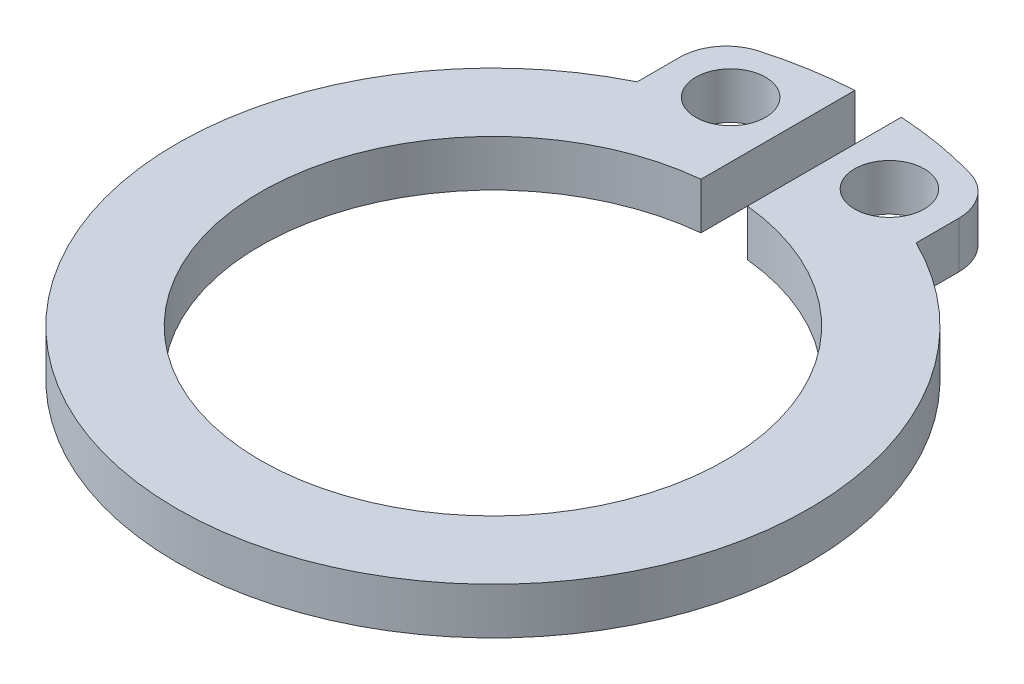
ISO-10303-21;
HEADER;
FILE_DESCRIPTION(('STEP AP214'),'2;1');
FILE_NAME('part.step','',(''),(''),'','','');
FILE_SCHEMA(('AUTOMOTIVE_DESIGN { 1 0 10303 214 1 1 1 1 }'));
ENDSEC;
DATA;
#1=APPLICATION_CONTEXT('core data for automotive mechanical design processes');
#2=APPLICATION_PROTOCOL_DEFINITION('international standard','automotive_design',2000,#1);
#3=PRODUCT_CONTEXT('',#1,'mechanical');
#4=PRODUCT('Part','Part','',(#3));
#5=PRODUCT_RELATED_PRODUCT_CATEGORY('part','',(#4));
#6=PRODUCT_DEFINITION_FORMATION('','',#4);
#7=PRODUCT_DEFINITION_CONTEXT('part definition',#1,'design');
#8=PRODUCT_DEFINITION('design','',#6,#7);
#9=PRODUCT_DEFINITION_SHAPE('','',#8);
#10=(LENGTH_UNIT() NAMED_UNIT(*) SI_UNIT(.MILLI.,.METRE.));
#11=(NAMED_UNIT(*) PLANE_ANGLE_UNIT() SI_UNIT($,.RADIAN.));
#12=(NAMED_UNIT(*) SI_UNIT($,.STERADIAN.) SOLID_ANGLE_UNIT());
#13=UNCERTAINTY_MEASURE_WITH_UNIT(LENGTH_MEASURE(1.E-05),#10,'distance_accuracy_value','');
#14=(GEOMETRIC_REPRESENTATION_CONTEXT(3) GLOBAL_UNCERTAINTY_ASSIGNED_CONTEXT((#13)) GLOBAL_UNIT_ASSIGNED_CONTEXT((#10,
#11,#12)) REPRESENTATION_CONTEXT('',''));
#15=CARTESIAN_POINT('',(0.,0.,0.));
#16=DIRECTION('',(0.,0.,1.));
#17=DIRECTION('',(1.,0.,0.));
#18=AXIS2_PLACEMENT_3D('',#15,#16,#17);
#19=CARTESIAN_POINT('',(0.,1.,0.));
#20=DIRECTION('',(0.,-1.,0.));
#21=DIRECTION('',(0.,0.,-1.));
#22=AXIS2_PLACEMENT_3D('',#19,#20,#21);
#23=CYLINDRICAL_SURFACE('',#22,6.8);
#24=CARTESIAN_POINT('',(0.,1.,0.));
#25=DIRECTION('',(0.,1.,0.));
#26=DIRECTION('',(0.,0.,1.));
#27=AXIS2_PLACEMENT_3D('',#24,#25,#26);
#28=CIRCLE('',#27,6.8);
#29=CARTESIAN_POINT('',(-3.,1.,-6.10245852095694));
#30=VERTEX_POINT('',#29);
#31=CARTESIAN_POINT('',(3.,1.,-6.10245852095694));
#32=VERTEX_POINT('',#31);
#33=EDGE_CURVE('E151',#30,#32,#28,.T.);
#34=ORIENTED_EDGE('',*,*,#33,.F.);
#35=DIRECTION('',(0.,-1.,0.));
#36=VECTOR('',#35,1.);
#37=CARTESIAN_POINT('',(-3.,4.31860883601564,-6.10245852095694));
#38=LINE('',#37,#36);
#39=CARTESIAN_POINT('',(-3.,0.,-6.10245852095694));
#40=VERTEX_POINT('',#39);
#41=EDGE_CURVE('E225',#30,#40,#38,.T.);
#42=ORIENTED_EDGE('',*,*,#41,.T.);
#43=CARTESIAN_POINT('',(0.,0.,0.));
#44=DIRECTION('',(0.,1.,0.));
#45=DIRECTION('',(0.,0.,1.));
#46=AXIS2_PLACEMENT_3D('',#43,#44,#45);
#47=CIRCLE('',#46,6.8);
#48=CARTESIAN_POINT('',(3.,0.,-6.10245852095694));
#49=VERTEX_POINT('',#48);
#50=EDGE_CURVE('E145',#40,#49,#47,.T.);
#51=ORIENTED_EDGE('',*,*,#50,.T.);
#52=DIRECTION('',(0.,-1.,0.));
#53=VECTOR('',#52,1.);
#54=CARTESIAN_POINT('',(3.,4.31860883601564,-6.10245852095694));
#55=LINE('',#54,#53);
#56=EDGE_CURVE('E132',#32,#49,#55,.T.);
#57=ORIENTED_EDGE('',*,*,#56,.F.);
#58=EDGE_LOOP('',(#34,#42,#51,#57));
#59=FACE_BOUND('',#58,.T.);
#60=ADVANCED_FACE('F43',(#59),#23,.T.);
#61=CARTESIAN_POINT('',(0.,1.,0.));
#62=DIRECTION('',(0.,1.,0.));
#63=DIRECTION('',(0.,0.,1.));
#64=AXIS2_PLACEMENT_3D('',#61,#62,#63);
#65=PLANE('',#64);
#66=CARTESIAN_POINT('',(1.70769331722576,1.,-6.82103805747136));
#67=DIRECTION('',(0.,-1.,0.));
#68=DIRECTION('',(0.,0.,-1.));
#69=AXIS2_PLACEMENT_3D('',#66,#67,#68);
#70=CIRCLE('',#69,0.75);
#71=CARTESIAN_POINT('',(1.70769331722576,1.,-7.57103805747136));
#72=VERTEX_POINT('',#71);
#73=EDGE_CURVE('E141',#72,#72,#70,.T.);
#74=ORIENTED_EDGE('',*,*,#73,.T.);
#75=EDGE_LOOP('',(#74));
#76=FACE_BOUND('',#75,.T.);
#77=CARTESIAN_POINT('',(-1.70769331722576,1.,-6.82103805747136));
#78=DIRECTION('',(0.,-1.,0.));
#79=DIRECTION('',(0.,0.,1.));
#80=AXIS2_PLACEMENT_3D('',#77,#78,#79);
#81=CIRCLE('',#80,0.75);
#82=CARTESIAN_POINT('',(-1.70769331722576,1.,-6.07103805747136));
#83=VERTEX_POINT('',#82);
#84=EDGE_CURVE('E236',#83,#83,#81,.T.);
#85=ORIENTED_EDGE('',*,*,#84,.T.);
#86=EDGE_LOOP('',(#85));
#87=FACE_BOUND('',#86,.T.);
#88=CARTESIAN_POINT('',(0.,1.,0.));
#89=DIRECTION('',(0.,1.,0.));
#90=DIRECTION('',(0.,0.,1.));
#91=AXIS2_PLACEMENT_3D('',#88,#89,#90);
#92=CIRCLE('',#91,5.);
#93=CARTESIAN_POINT('',(-0.500000000000003,1.,-4.9749371855331));
#94=VERTEX_POINT('',#93);
#95=CARTESIAN_POINT('',(0.500000000000001,1.,-4.9749371855331));
#96=VERTEX_POINT('',#95);
#97=EDGE_CURVE('E126',#94,#96,#92,.T.);
#98=ORIENTED_EDGE('',*,*,#97,.F.);
#99=DIRECTION('',(0.,0.,1.));
#100=VECTOR('',#99,1.);
#101=CARTESIAN_POINT('',(-0.500000000000001,1.,-8.28492607088319));
#102=LINE('',#101,#100);
#103=CARTESIAN_POINT('',(-0.500000000000001,1.,-8.28492607088319));
#104=VERTEX_POINT('',#103);
#105=EDGE_CURVE('E67',#104,#94,#102,.T.);
#106=ORIENTED_EDGE('',*,*,#105,.F.);
#107=CARTESIAN_POINT('',(0.,1.,0.));
#108=DIRECTION('',(0.,1.,0.));
#109=DIRECTION('',(0.,0.,1.));
#110=AXIS2_PLACEMENT_3D('',#107,#108,#109);
#111=CIRCLE('',#110,8.3);
#112=CARTESIAN_POINT('',(-2.27397260273972,1.,-7.9824212242896));
#113=VERTEX_POINT('',#112);
#114=EDGE_CURVE('E221',#113,#104,#111,.F.);
#115=ORIENTED_EDGE('',*,*,#114,.F.);
#116=CARTESIAN_POINT('',(-2.,1.,-7.02068372738724));
#117=DIRECTION('',(0.,1.,0.));
#118=DIRECTION('',(0.,0.,1.));
#119=AXIS2_PLACEMENT_3D('',#116,#117,#118);
#120=CIRCLE('',#119,1.);
#121=CARTESIAN_POINT('',(-3.,1.,-7.02068372738724));
#122=VERTEX_POINT('',#121);
#123=EDGE_CURVE('E176',#113,#122,#120,.T.);
#124=ORIENTED_EDGE('',*,*,#123,.T.);
#125=DIRECTION('',(0.,0.,-1.));
#126=VECTOR('',#125,1.);
#127=CARTESIAN_POINT('',(-3.,1.,-7.73886296557834));
#128=LINE('',#127,#126);
#129=EDGE_CURVE('E215',#30,#122,#128,.T.);
#130=ORIENTED_EDGE('',*,*,#129,.F.);
#131=ORIENTED_EDGE('',*,*,#33,.T.);
#132=DIRECTION('',(0.,0.,1.));
#133=VECTOR('',#132,1.);
#134=CARTESIAN_POINT('',(3.,1.,-7.73886296557834));
#135=LINE('',#134,#133);
#136=CARTESIAN_POINT('',(3.,1.,-7.02068372738724));
#137=VERTEX_POINT('',#136);
#138=EDGE_CURVE('E203',#137,#32,#135,.T.);
#139=ORIENTED_EDGE('',*,*,#138,.F.);
#140=CARTESIAN_POINT('',(2.,1.,-7.02068372738724));
#141=DIRECTION('',(0.,1.,0.));
#142=DIRECTION('',(0.,0.,1.));
#143=AXIS2_PLACEMENT_3D('',#140,#141,#142);
#144=CIRCLE('',#143,1.);
#145=CARTESIAN_POINT('',(2.27397260273973,1.,-7.9824212242896));
#146=VERTEX_POINT('',#145);
#147=EDGE_CURVE('E173',#137,#146,#144,.T.);
#148=ORIENTED_EDGE('',*,*,#147,.T.);
#149=CARTESIAN_POINT('',(0.,1.,0.));
#150=DIRECTION('',(0.,1.,0.));
#151=DIRECTION('',(0.,0.,1.));
#152=AXIS2_PLACEMENT_3D('',#149,#150,#151);
#153=CIRCLE('',#152,8.3);
#154=CARTESIAN_POINT('',(0.500000000000001,1.,-8.28492607088319));
#155=VERTEX_POINT('',#154);
#156=EDGE_CURVE('E128',#155,#146,#153,.F.);
#157=ORIENTED_EDGE('',*,*,#156,.F.);
#158=DIRECTION('',(0.,0.,-1.));
#159=VECTOR('',#158,1.);
#160=CARTESIAN_POINT('',(0.500000000000001,1.,-8.28492607088319));
#161=LINE('',#160,#159);
#162=EDGE_CURVE('E123',#96,#155,#161,.T.);
#163=ORIENTED_EDGE('',*,*,#162,.F.);
#164=EDGE_LOOP('',(#98,#106,#115,#124,#130,#131,#139,#148,#157,#163));
#165=FACE_BOUND('',#164,.T.);
#166=ADVANCED_FACE('F124',(#76,#87,#165),#65,.T.);
#167=CARTESIAN_POINT('',(0.,0.,0.));
#168=DIRECTION('',(0.,1.,0.));
#169=DIRECTION('',(0.,0.,1.));
#170=AXIS2_PLACEMENT_3D('',#167,#168,#169);
#171=PLANE('',#170);
#172=CARTESIAN_POINT('',(1.70769331722576,0.,-6.82103805747136));
#173=DIRECTION('',(0.,-1.,0.));
#174=DIRECTION('',(0.,0.,-1.));
#175=AXIS2_PLACEMENT_3D('',#172,#173,#174);
#176=CIRCLE('',#175,0.75);
#177=CARTESIAN_POINT('',(1.70769331722576,0.,-7.57103805747136));
#178=VERTEX_POINT('',#177);
#179=EDGE_CURVE('E244',#178,#178,#176,.T.);
#180=ORIENTED_EDGE('',*,*,#179,.F.);
#181=EDGE_LOOP('',(#180));
#182=FACE_BOUND('',#181,.T.);
#183=CARTESIAN_POINT('',(-1.70769331722576,0.,-6.82103805747136));
#184=DIRECTION('',(0.,-1.,0.));
#185=DIRECTION('',(0.,0.,1.));
#186=AXIS2_PLACEMENT_3D('',#183,#184,#185);
#187=CIRCLE('',#186,0.75);
#188=CARTESIAN_POINT('',(-1.70769331722576,0.,-6.07103805747136));
#189=VERTEX_POINT('',#188);
#190=EDGE_CURVE('E240',#189,#189,#187,.T.);
#191=ORIENTED_EDGE('',*,*,#190,.F.);
#192=EDGE_LOOP('',(#191));
#193=FACE_BOUND('',#192,.T.);
#194=DIRECTION('',(0.,0.,1.));
#195=VECTOR('',#194,1.);
#196=CARTESIAN_POINT('',(-0.500000000000001,0.,-8.28492607088319));
#197=LINE('',#196,#195);
#198=CARTESIAN_POINT('',(-0.500000000000001,0.,-8.28492607088319));
#199=VERTEX_POINT('',#198);
#200=CARTESIAN_POINT('',(-0.500000000000001,0.,-4.9749371855331));
#201=VERTEX_POINT('',#200);
#202=EDGE_CURVE('E212',#199,#201,#197,.T.);
#203=ORIENTED_EDGE('',*,*,#202,.T.);
#204=CARTESIAN_POINT('',(0.,0.,0.));
#205=DIRECTION('',(0.,1.,0.));
#206=DIRECTION('',(0.,0.,1.));
#207=AXIS2_PLACEMENT_3D('',#204,#205,#206);
#208=CIRCLE('',#207,5.);
#209=CARTESIAN_POINT('',(0.500000000000003,0.,-4.9749371855331));
#210=VERTEX_POINT('',#209);
#211=EDGE_CURVE('E146',#201,#210,#208,.T.);
#212=ORIENTED_EDGE('',*,*,#211,.T.);
#213=DIRECTION('',(0.,0.,-1.));
#214=VECTOR('',#213,1.);
#215=CARTESIAN_POINT('',(0.500000000000001,0.,-8.28492607088319));
#216=LINE('',#215,#214);
#217=CARTESIAN_POINT('',(0.500000000000001,0.,-8.28492607088319));
#218=VERTEX_POINT('',#217);
#219=EDGE_CURVE('E59',#210,#218,#216,.T.);
#220=ORIENTED_EDGE('',*,*,#219,.T.);
#221=CARTESIAN_POINT('',(0.,0.,0.));
#222=DIRECTION('',(0.,-1.,0.));
#223=DIRECTION('',(0.,0.,-1.));
#224=AXIS2_PLACEMENT_3D('',#221,#222,#223);
#225=CIRCLE('',#224,8.3);
#226=CARTESIAN_POINT('',(2.27397260273973,0.,-7.9824212242896));
#227=VERTEX_POINT('',#226);
#228=EDGE_CURVE('E185',#218,#227,#225,.T.);
#229=ORIENTED_EDGE('',*,*,#228,.T.);
#230=CARTESIAN_POINT('',(2.,0.,-7.02068372738724));
#231=DIRECTION('',(0.,1.,0.));
#232=DIRECTION('',(0.,0.,1.));
#233=AXIS2_PLACEMENT_3D('',#230,#231,#232);
#234=CIRCLE('',#233,1.);
#235=CARTESIAN_POINT('',(3.,0.,-7.02068372738724));
#236=VERTEX_POINT('',#235);
#237=EDGE_CURVE('E164',#227,#236,#234,.F.);
#238=ORIENTED_EDGE('',*,*,#237,.T.);
#239=DIRECTION('',(0.,0.,1.));
#240=VECTOR('',#239,1.);
#241=CARTESIAN_POINT('',(3.,0.,-7.73886296557834));
#242=LINE('',#241,#240);
#243=EDGE_CURVE('E192',#236,#49,#242,.T.);
#244=ORIENTED_EDGE('',*,*,#243,.T.);
#245=ORIENTED_EDGE('',*,*,#50,.F.);
#246=DIRECTION('',(0.,0.,-1.));
#247=VECTOR('',#246,1.);
#248=CARTESIAN_POINT('',(-3.,0.,-7.73886296557834));
#249=LINE('',#248,#247);
#250=CARTESIAN_POINT('',(-3.,0.,-7.02068372738724));
#251=VERTEX_POINT('',#250);
#252=EDGE_CURVE('E193',#40,#251,#249,.T.);
#253=ORIENTED_EDGE('',*,*,#252,.T.);
#254=CARTESIAN_POINT('',(-2.,0.,-7.02068372738724));
#255=DIRECTION('',(0.,1.,0.));
#256=DIRECTION('',(0.,0.,1.));
#257=AXIS2_PLACEMENT_3D('',#254,#255,#256);
#258=CIRCLE('',#257,1.);
#259=CARTESIAN_POINT('',(-2.27397260273972,0.,-7.9824212242896));
#260=VERTEX_POINT('',#259);
#261=EDGE_CURVE('E167',#251,#260,#258,.F.);
#262=ORIENTED_EDGE('',*,*,#261,.T.);
#263=CARTESIAN_POINT('',(0.,0.,0.));
#264=DIRECTION('',(0.,-1.,0.));
#265=DIRECTION('',(0.,0.,1.));
#266=AXIS2_PLACEMENT_3D('',#263,#264,#265);
#267=CIRCLE('',#266,8.3);
#268=EDGE_CURVE('E199',#260,#199,#267,.T.);
#269=ORIENTED_EDGE('',*,*,#268,.T.);
#270=EDGE_LOOP('',(#203,#212,#220,#229,#238,#244,#245,#253,#262,#269));
#271=FACE_BOUND('',#270,.T.);
#272=ADVANCED_FACE('F189',(#182,#193,#271),#171,.F.);
#273=CARTESIAN_POINT('',(0.,1.,0.));
#274=DIRECTION('',(0.,-1.,0.));
#275=DIRECTION('',(0.,0.,-1.));
#276=AXIS2_PLACEMENT_3D('',#273,#274,#275);
#277=CYLINDRICAL_SURFACE('',#276,5.);
#278=DIRECTION('',(0.,-1.,0.));
#279=VECTOR('',#278,1.);
#280=CARTESIAN_POINT('',(-0.500000000000001,1.,-4.9749371855331));
#281=LINE('',#280,#279);
#282=EDGE_CURVE('E140',#94,#201,#281,.T.);
#283=ORIENTED_EDGE('',*,*,#282,.F.);
#284=ORIENTED_EDGE('',*,*,#97,.T.);
#285=DIRECTION('',(0.,-1.,0.));
#286=VECTOR('',#285,1.);
#287=CARTESIAN_POINT('',(0.500000000000001,1.,-4.9749371855331));
#288=LINE('',#287,#286);
#289=EDGE_CURVE('E134',#96,#210,#288,.T.);
#290=ORIENTED_EDGE('',*,*,#289,.T.);
#291=ORIENTED_EDGE('',*,*,#211,.F.);
#292=EDGE_LOOP('',(#283,#284,#290,#291));
#293=FACE_BOUND('',#292,.T.);
#294=ADVANCED_FACE('F143',(#293),#277,.F.);
#295=CARTESIAN_POINT('',(3.,4.31860883601564,-7.73886296557834));
#296=DIRECTION('',(1.,0.,0.));
#297=DIRECTION('',(0.,0.,-1.));
#298=AXIS2_PLACEMENT_3D('',#295,#296,#297);
#299=PLANE('',#298);
#300=ORIENTED_EDGE('',*,*,#243,.F.);
#301=DIRECTION('',(0.,-1.,0.));
#302=VECTOR('',#301,1.);
#303=CARTESIAN_POINT('',(3.,4.31860883601564,-7.02068372738724));
#304=LINE('',#303,#302);
#305=EDGE_CURVE('E11',#236,#137,#304,.F.);
#306=ORIENTED_EDGE('',*,*,#305,.T.);
#307=ORIENTED_EDGE('',*,*,#138,.T.);
#308=ORIENTED_EDGE('',*,*,#56,.T.);
#309=EDGE_LOOP('',(#300,#306,#307,#308));
#310=FACE_BOUND('',#309,.T.);
#311=ADVANCED_FACE('F303',(#310),#299,.T.);
#312=CARTESIAN_POINT('',(0.500000000000001,4.31860883601564,-8.28492607088319));
#313=DIRECTION('',(-1.,0.,0.));
#314=DIRECTION('',(0.,0.,1.));
#315=AXIS2_PLACEMENT_3D('',#312,#313,#314);
#316=PLANE('',#315);
#317=ORIENTED_EDGE('',*,*,#219,.F.);
#318=ORIENTED_EDGE('',*,*,#289,.F.);
#319=ORIENTED_EDGE('',*,*,#162,.T.);
#320=DIRECTION('',(0.,-1.,0.));
#321=VECTOR('',#320,1.);
#322=CARTESIAN_POINT('',(0.500000000000001,4.31860883601564,-8.28492607088319));
#323=LINE('',#322,#321);
#324=EDGE_CURVE('E131',#155,#218,#323,.T.);
#325=ORIENTED_EDGE('',*,*,#324,.T.);
#326=EDGE_LOOP('',(#317,#318,#319,#325));
#327=FACE_BOUND('',#326,.T.);
#328=ADVANCED_FACE('F135',(#327),#316,.T.);
#329=CARTESIAN_POINT('',(0.,4.31860883601564,0.));
#330=DIRECTION('',(0.,-1.,0.));
#331=DIRECTION('',(0.,0.,-1.));
#332=AXIS2_PLACEMENT_3D('',#329,#330,#331);
#333=CYLINDRICAL_SURFACE('',#332,8.3);
#334=ORIENTED_EDGE('',*,*,#156,.T.);
#335=DIRECTION('',(0.,-1.,0.));
#336=VECTOR('',#335,1.);
#337=CARTESIAN_POINT('',(2.27397260273973,4.31860883601564,-7.9824212242896));
#338=LINE('',#337,#336);
#339=EDGE_CURVE('E52',#146,#227,#338,.T.);
#340=ORIENTED_EDGE('',*,*,#339,.T.);
#341=ORIENTED_EDGE('',*,*,#228,.F.);
#342=ORIENTED_EDGE('',*,*,#324,.F.);
#343=EDGE_LOOP('',(#334,#340,#341,#342));
#344=FACE_BOUND('',#343,.T.);
#345=ADVANCED_FACE('F184',(#344),#333,.T.);
#346=CARTESIAN_POINT('',(-3.,4.31860883601564,-7.73886296557834));
#347=DIRECTION('',(-1.,0.,0.));
#348=DIRECTION('',(0.,0.,1.));
#349=AXIS2_PLACEMENT_3D('',#346,#347,#348);
#350=PLANE('',#349);
#351=ORIENTED_EDGE('',*,*,#129,.T.);
#352=DIRECTION('',(0.,-1.,0.));
#353=VECTOR('',#352,1.);
#354=CARTESIAN_POINT('',(-3.,4.31860883601564,-7.02068372738724));
#355=LINE('',#354,#353);
#356=EDGE_CURVE('E159',#122,#251,#355,.T.);
#357=ORIENTED_EDGE('',*,*,#356,.T.);
#358=ORIENTED_EDGE('',*,*,#252,.F.);
#359=ORIENTED_EDGE('',*,*,#41,.F.);
#360=EDGE_LOOP('',(#351,#357,#358,#359));
#361=FACE_BOUND('',#360,.T.);
#362=ADVANCED_FACE('F297',(#361),#350,.T.);
#363=CARTESIAN_POINT('',(0.,4.31860883601564,0.));
#364=DIRECTION('',(0.,-1.,0.));
#365=DIRECTION('',(0.,0.,-1.));
#366=AXIS2_PLACEMENT_3D('',#363,#364,#365);
#367=CYLINDRICAL_SURFACE('',#366,8.3);
#368=ORIENTED_EDGE('',*,*,#268,.F.);
#369=DIRECTION('',(0.,-1.,0.));
#370=VECTOR('',#369,1.);
#371=CARTESIAN_POINT('',(-2.27397260273972,4.31860883601564,-7.9824212242896));
#372=LINE('',#371,#370);
#373=EDGE_CURVE('E170',#260,#113,#372,.F.);
#374=ORIENTED_EDGE('',*,*,#373,.T.);
#375=ORIENTED_EDGE('',*,*,#114,.T.);
#376=DIRECTION('',(0.,-1.,0.));
#377=VECTOR('',#376,1.);
#378=CARTESIAN_POINT('',(-0.500000000000001,4.31860883601564,-8.28492607088319));
#379=LINE('',#378,#377);
#380=EDGE_CURVE('E224',#104,#199,#379,.T.);
#381=ORIENTED_EDGE('',*,*,#380,.T.);
#382=EDGE_LOOP('',(#368,#374,#375,#381));
#383=FACE_BOUND('',#382,.T.);
#384=ADVANCED_FACE('F289',(#383),#367,.T.);
#385=CARTESIAN_POINT('',(-0.500000000000001,4.31860883601564,-8.28492607088319));
#386=DIRECTION('',(1.,0.,0.));
#387=DIRECTION('',(0.,0.,-1.));
#388=AXIS2_PLACEMENT_3D('',#385,#386,#387);
#389=PLANE('',#388);
#390=ORIENTED_EDGE('',*,*,#380,.F.);
#391=ORIENTED_EDGE('',*,*,#105,.T.);
#392=ORIENTED_EDGE('',*,*,#282,.T.);
#393=ORIENTED_EDGE('',*,*,#202,.F.);
#394=EDGE_LOOP('',(#390,#391,#392,#393));
#395=FACE_BOUND('',#394,.T.);
#396=ADVANCED_FACE('F284',(#395),#389,.T.);
#397=CARTESIAN_POINT('',(-2.,4.31860883601564,-7.02068372738724));
#398=DIRECTION('',(0.,-1.,0.));
#399=DIRECTION('',(0.,0.,-1.));
#400=AXIS2_PLACEMENT_3D('',#397,#398,#399);
#401=CYLINDRICAL_SURFACE('',#400,1.);
#402=ORIENTED_EDGE('',*,*,#123,.F.);
#403=ORIENTED_EDGE('',*,*,#373,.F.);
#404=ORIENTED_EDGE('',*,*,#261,.F.);
#405=ORIENTED_EDGE('',*,*,#356,.F.);
#406=EDGE_LOOP('',(#402,#403,#404,#405));
#407=FACE_BOUND('',#406,.T.);
#408=ADVANCED_FACE('F272',(#407),#401,.T.);
#409=CARTESIAN_POINT('',(2.,4.31860883601564,-7.02068372738724));
#410=DIRECTION('',(0.,-1.,0.));
#411=DIRECTION('',(0.,0.,-1.));
#412=AXIS2_PLACEMENT_3D('',#409,#410,#411);
#413=CYLINDRICAL_SURFACE('',#412,1.);
#414=ORIENTED_EDGE('',*,*,#147,.F.);
#415=ORIENTED_EDGE('',*,*,#305,.F.);
#416=ORIENTED_EDGE('',*,*,#237,.F.);
#417=ORIENTED_EDGE('',*,*,#339,.F.);
#418=EDGE_LOOP('',(#414,#415,#416,#417));
#419=FACE_BOUND('',#418,.T.);
#420=ADVANCED_FACE('F45',(#419),#413,.T.);
#421=CARTESIAN_POINT('',(-1.70769331722576,1.,-6.82103805747136));
#422=DIRECTION('',(0.,-1.,0.));
#423=DIRECTION('',(0.,0.,-1.));
#424=AXIS2_PLACEMENT_3D('',#421,#422,#423);
#425=CYLINDRICAL_SURFACE('',#424,0.75);
#426=ORIENTED_EDGE('',*,*,#84,.F.);
#427=EDGE_LOOP('',(#426));
#428=FACE_BOUND('',#427,.T.);
#429=ORIENTED_EDGE('',*,*,#190,.T.);
#430=EDGE_LOOP('',(#429));
#431=FACE_BOUND('',#430,.T.);
#432=ADVANCED_FACE('F257',(#428,#431),#425,.F.);
#433=CARTESIAN_POINT('',(1.70769331722576,1.,-6.82103805747136));
#434=DIRECTION('',(0.,-1.,0.));
#435=DIRECTION('',(0.,0.,-1.));
#436=AXIS2_PLACEMENT_3D('',#433,#434,#435);
#437=CYLINDRICAL_SURFACE('',#436,0.75);
#438=ORIENTED_EDGE('',*,*,#73,.F.);
#439=EDGE_LOOP('',(#438));
#440=FACE_BOUND('',#439,.T.);
#441=ORIENTED_EDGE('',*,*,#179,.T.);
#442=EDGE_LOOP('',(#441));
#443=FACE_BOUND('',#442,.T.);
#444=ADVANCED_FACE('F254',(#440,#443),#437,.F.);
#445=CLOSED_SHELL('',(#60,#166,#272,#294,#311,#328,#345,#362,#384,#396,#408,#420,#432,#444));
#446=MANIFOLD_SOLID_BREP('B2',#445);
#447=ADVANCED_BREP_SHAPE_REPRESENTATION('',(#18,#446),#14);
#448=SHAPE_DEFINITION_REPRESENTATION(#9,#447);
ENDSEC;
END-ISO-10303-21;
